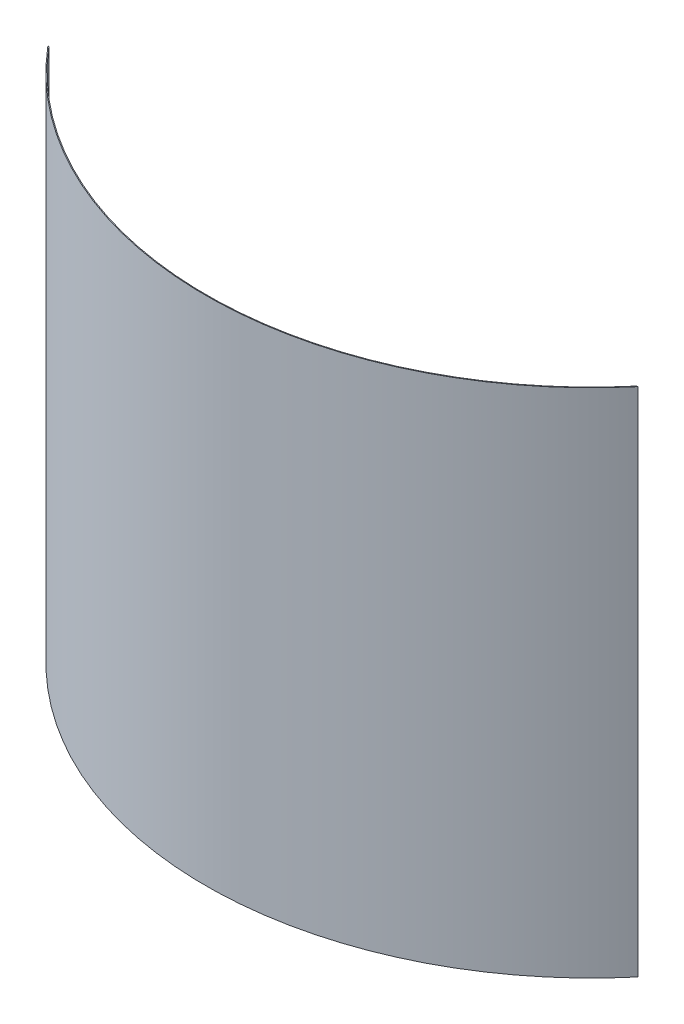
ISO-10303-21;
HEADER;
FILE_DESCRIPTION(('STEP AP214'),'2;1');
FILE_NAME('part.step','',(''),(''),'','','');
FILE_SCHEMA(('AUTOMOTIVE_DESIGN { 1 0 10303 214 1 1 1 1 }'));
ENDSEC;
DATA;
#1=APPLICATION_CONTEXT('core data for automotive mechanical design processes');
#2=APPLICATION_PROTOCOL_DEFINITION('international standard','automotive_design',2000,#1);
#3=PRODUCT_CONTEXT('',#1,'mechanical');
#4=PRODUCT('Part','Part','',(#3));
#5=PRODUCT_RELATED_PRODUCT_CATEGORY('part','',(#4));
#6=PRODUCT_DEFINITION_FORMATION('','',#4);
#7=PRODUCT_DEFINITION_CONTEXT('part definition',#1,'design');
#8=PRODUCT_DEFINITION('design','',#6,#7);
#9=PRODUCT_DEFINITION_SHAPE('','',#8);
#10=(LENGTH_UNIT() NAMED_UNIT(*) SI_UNIT(.MILLI.,.METRE.));
#11=(NAMED_UNIT(*) PLANE_ANGLE_UNIT() SI_UNIT($,.RADIAN.));
#12=(NAMED_UNIT(*) SI_UNIT($,.STERADIAN.) SOLID_ANGLE_UNIT());
#13=UNCERTAINTY_MEASURE_WITH_UNIT(LENGTH_MEASURE(1.E-05),#10,'distance_accuracy_value','');
#14=(GEOMETRIC_REPRESENTATION_CONTEXT(3) GLOBAL_UNCERTAINTY_ASSIGNED_CONTEXT((#13)) GLOBAL_UNIT_ASSIGNED_CONTEXT((#10,
#11,#12)) REPRESENTATION_CONTEXT('',''));
#15=CARTESIAN_POINT('',(0.,0.,0.));
#16=DIRECTION('',(0.,0.,1.));
#17=DIRECTION('',(1.,0.,0.));
#18=AXIS2_PLACEMENT_3D('',#15,#16,#17);
#19=CARTESIAN_POINT('',(292.1,508.,247.379439897498));
#20=DIRECTION('',(0.,0.,-1.));
#21=DIRECTION('',(-1.,0.,0.));
#22=AXIS2_PLACEMENT_3D('',#19,#20,#21);
#23=PLANE('',#22);
#24=DIRECTION('',(1.,0.,0.));
#25=VECTOR('',#24,1.);
#26=CARTESIAN_POINT('',(292.1,0.,247.379439897498));
#27=LINE('',#26,#25);
#28=CARTESIAN_POINT('',(292.1,0.,247.379439897498));
#29=VERTEX_POINT('',#28);
#30=CARTESIAN_POINT('',(293.139386835107,0.,247.379439897498));
#31=VERTEX_POINT('',#30);
#32=EDGE_CURVE('E96',#29,#31,#27,.T.);
#33=ORIENTED_EDGE('',*,*,#32,.F.);
#34=DIRECTION('',(0.,-1.,0.));
#35=VECTOR('',#34,1.);
#36=CARTESIAN_POINT('',(292.1,508.,247.379439897498));
#37=LINE('',#36,#35);
#38=CARTESIAN_POINT('',(292.1,508.,247.379439897498));
#39=VERTEX_POINT('',#38);
#40=EDGE_CURVE('E11',#39,#29,#37,.T.);
#41=ORIENTED_EDGE('',*,*,#40,.F.);
#42=DIRECTION('',(1.,0.,0.));
#43=VECTOR('',#42,1.);
#44=CARTESIAN_POINT('',(292.1,508.,247.379439897498));
#45=LINE('',#44,#43);
#46=CARTESIAN_POINT('',(293.139386835107,508.,247.379439897498));
#47=VERTEX_POINT('',#46);
#48=EDGE_CURVE('E91',#39,#47,#45,.T.);
#49=ORIENTED_EDGE('',*,*,#48,.T.);
#50=DIRECTION('',(0.,-1.,0.));
#51=VECTOR('',#50,1.);
#52=CARTESIAN_POINT('',(293.139386835107,508.,247.379439897498));
#53=LINE('',#52,#51);
#54=EDGE_CURVE('E34',#47,#31,#53,.T.);
#55=ORIENTED_EDGE('',*,*,#54,.T.);
#56=EDGE_LOOP('',(#33,#41,#49,#55));
#57=FACE_BOUND('',#56,.T.);
#58=ADVANCED_FACE('F31',(#57),#23,.T.);
#59=CARTESIAN_POINT('',(0.,508.,0.));
#60=DIRECTION('',(0.,-1.,0.));
#61=DIRECTION('',(0.,0.,-1.));
#62=AXIS2_PLACEMENT_3D('',#59,#60,#61);
#63=CYLINDRICAL_SURFACE('',#62,382.778);
#64=CARTESIAN_POINT('',(0.,0.,0.));
#65=DIRECTION('',(0.,-1.,0.));
#66=DIRECTION('',(0.,0.,-1.));
#67=AXIS2_PLACEMENT_3D('',#64,#65,#66);
#68=CIRCLE('',#67,382.778);
#69=CARTESIAN_POINT('',(-292.1,0.,247.379439897499));
#70=VERTEX_POINT('',#69);
#71=EDGE_CURVE('E64',#29,#70,#68,.T.);
#72=ORIENTED_EDGE('',*,*,#71,.T.);
#73=DIRECTION('',(0.,-1.,0.));
#74=VECTOR('',#73,1.);
#75=CARTESIAN_POINT('',(-292.1,508.,247.379439897499));
#76=LINE('',#75,#74);
#77=CARTESIAN_POINT('',(-292.1,508.,247.379439897499));
#78=VERTEX_POINT('',#77);
#79=EDGE_CURVE('E40',#78,#70,#76,.T.);
#80=ORIENTED_EDGE('',*,*,#79,.F.);
#81=CARTESIAN_POINT('',(0.,508.,0.));
#82=DIRECTION('',(0.,-1.,0.));
#83=DIRECTION('',(0.,0.,-1.));
#84=AXIS2_PLACEMENT_3D('',#81,#82,#83);
#85=CIRCLE('',#84,382.778);
#86=EDGE_CURVE('E79',#39,#78,#85,.T.);
#87=ORIENTED_EDGE('',*,*,#86,.F.);
#88=ORIENTED_EDGE('',*,*,#40,.T.);
#89=EDGE_LOOP('',(#72,#80,#87,#88));
#90=FACE_BOUND('',#89,.T.);
#91=ADVANCED_FACE('F106',(#90),#63,.F.);
#92=CARTESIAN_POINT('',(-292.1,508.,247.379439897498));
#93=DIRECTION('',(0.,0.,1.));
#94=DIRECTION('',(1.,0.,0.));
#95=AXIS2_PLACEMENT_3D('',#92,#93,#94);
#96=PLANE('',#95);
#97=DIRECTION('',(-1.,0.,0.));
#98=VECTOR('',#97,1.);
#99=CARTESIAN_POINT('',(-292.1,0.,247.379439897498));
#100=LINE('',#99,#98);
#101=CARTESIAN_POINT('',(-293.139386835107,0.,247.379439897498));
#102=VERTEX_POINT('',#101);
#103=EDGE_CURVE('E86',#70,#102,#100,.T.);
#104=ORIENTED_EDGE('',*,*,#103,.T.);
#105=DIRECTION('',(0.,-1.,0.));
#106=VECTOR('',#105,1.);
#107=CARTESIAN_POINT('',(-293.139386835107,508.,247.379439897498));
#108=LINE('',#107,#106);
#109=CARTESIAN_POINT('',(-293.139386835107,508.,247.379439897498));
#110=VERTEX_POINT('',#109);
#111=EDGE_CURVE('E83',#110,#102,#108,.T.);
#112=ORIENTED_EDGE('',*,*,#111,.F.);
#113=DIRECTION('',(-1.,0.,0.));
#114=VECTOR('',#113,1.);
#115=CARTESIAN_POINT('',(-292.1,508.,247.379439897498));
#116=LINE('',#115,#114);
#117=EDGE_CURVE('E76',#78,#110,#116,.T.);
#118=ORIENTED_EDGE('',*,*,#117,.F.);
#119=ORIENTED_EDGE('',*,*,#79,.T.);
#120=EDGE_LOOP('',(#104,#112,#118,#119));
#121=FACE_BOUND('',#120,.T.);
#122=ADVANCED_FACE('F84',(#121),#96,.F.);
#123=CARTESIAN_POINT('',(0.,508.,0.));
#124=DIRECTION('',(0.,-1.,0.));
#125=DIRECTION('',(0.,0.,-1.));
#126=AXIS2_PLACEMENT_3D('',#123,#124,#125);
#127=CYLINDRICAL_SURFACE('',#126,383.57175);
#128=CARTESIAN_POINT('',(0.,0.,0.));
#129=DIRECTION('',(0.,1.,0.));
#130=DIRECTION('',(0.,0.,1.));
#131=AXIS2_PLACEMENT_3D('',#128,#129,#130);
#132=CIRCLE('',#131,383.57175);
#133=EDGE_CURVE('E99',#102,#31,#132,.T.);
#134=ORIENTED_EDGE('',*,*,#133,.T.);
#135=ORIENTED_EDGE('',*,*,#54,.F.);
#136=CARTESIAN_POINT('',(0.,508.,0.));
#137=DIRECTION('',(0.,1.,0.));
#138=DIRECTION('',(0.,0.,1.));
#139=AXIS2_PLACEMENT_3D('',#136,#137,#138);
#140=CIRCLE('',#139,383.57175);
#141=EDGE_CURVE('E73',#110,#47,#140,.T.);
#142=ORIENTED_EDGE('',*,*,#141,.F.);
#143=ORIENTED_EDGE('',*,*,#111,.T.);
#144=EDGE_LOOP('',(#134,#135,#142,#143));
#145=FACE_BOUND('',#144,.T.);
#146=ADVANCED_FACE('F90',(#145),#127,.T.);
#147=CARTESIAN_POINT('',(0.,508.,0.));
#148=DIRECTION('',(0.,1.,0.));
#149=DIRECTION('',(0.,0.,1.));
#150=AXIS2_PLACEMENT_3D('',#147,#148,#149);
#151=PLANE('',#150);
#152=ORIENTED_EDGE('',*,*,#48,.F.);
#153=ORIENTED_EDGE('',*,*,#86,.T.);
#154=ORIENTED_EDGE('',*,*,#117,.T.);
#155=ORIENTED_EDGE('',*,*,#141,.T.);
#156=EDGE_LOOP('',(#152,#153,#154,#155));
#157=FACE_BOUND('',#156,.T.);
#158=ADVANCED_FACE('F78',(#157),#151,.T.);
#159=CARTESIAN_POINT('',(0.,0.,0.));
#160=DIRECTION('',(0.,1.,0.));
#161=DIRECTION('',(0.,0.,1.));
#162=AXIS2_PLACEMENT_3D('',#159,#160,#161);
#163=PLANE('',#162);
#164=ORIENTED_EDGE('',*,*,#32,.T.);
#165=ORIENTED_EDGE('',*,*,#133,.F.);
#166=ORIENTED_EDGE('',*,*,#103,.F.);
#167=ORIENTED_EDGE('',*,*,#71,.F.);
#168=EDGE_LOOP('',(#164,#165,#166,#167));
#169=FACE_BOUND('',#168,.T.);
#170=ADVANCED_FACE('F104',(#169),#163,.F.);
#171=CLOSED_SHELL('',(#58,#91,#122,#146,#158,#170));
#172=MANIFOLD_SOLID_BREP('B2',#171);
#173=ADVANCED_BREP_SHAPE_REPRESENTATION('',(#18,#172),#14);
#174=SHAPE_DEFINITION_REPRESENTATION(#9,#173);
ENDSEC;
END-ISO-10303-21;
